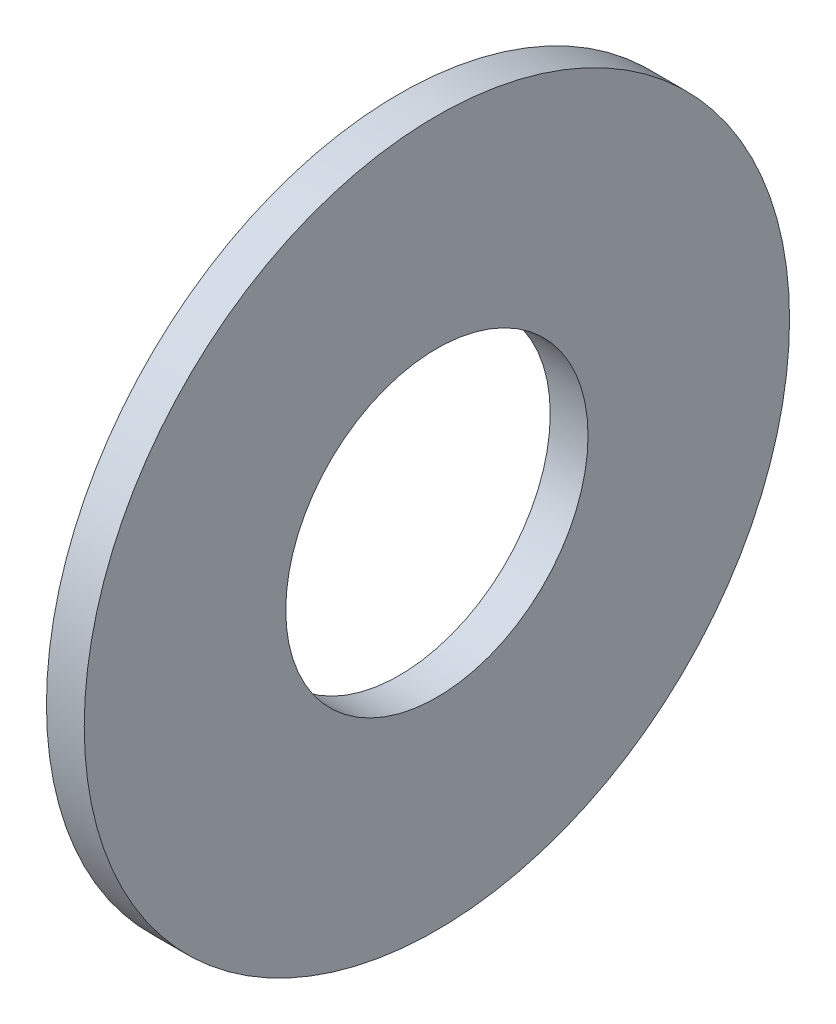
ISO-10303-21;
HEADER;
FILE_DESCRIPTION(('STEP AP214'),'2;1');
FILE_NAME('part.step','',(''),(''),'','','');
FILE_SCHEMA(('AUTOMOTIVE_DESIGN { 1 0 10303 214 1 1 1 1 }'));
ENDSEC;
DATA;
#1=APPLICATION_CONTEXT('core data for automotive mechanical design processes');
#2=APPLICATION_PROTOCOL_DEFINITION('international standard','automotive_design',2000,#1);
#3=PRODUCT_CONTEXT('',#1,'mechanical');
#4=PRODUCT('Part','Part','',(#3));
#5=PRODUCT_RELATED_PRODUCT_CATEGORY('part','',(#4));
#6=PRODUCT_DEFINITION_FORMATION('','',#4);
#7=PRODUCT_DEFINITION_CONTEXT('part definition',#1,'design');
#8=PRODUCT_DEFINITION('design','',#6,#7);
#9=PRODUCT_DEFINITION_SHAPE('','',#8);
#10=(LENGTH_UNIT() NAMED_UNIT(*) SI_UNIT(.MILLI.,.METRE.));
#11=(NAMED_UNIT(*) PLANE_ANGLE_UNIT() SI_UNIT($,.RADIAN.));
#12=(NAMED_UNIT(*) SI_UNIT($,.STERADIAN.) SOLID_ANGLE_UNIT());
#13=UNCERTAINTY_MEASURE_WITH_UNIT(LENGTH_MEASURE(1.E-05),#10,'distance_accuracy_value','');
#14=(GEOMETRIC_REPRESENTATION_CONTEXT(3) GLOBAL_UNCERTAINTY_ASSIGNED_CONTEXT((#13)) GLOBAL_UNIT_ASSIGNED_CONTEXT((#10,
#11,#12)) REPRESENTATION_CONTEXT('',''));
#15=CARTESIAN_POINT('',(0.,0.,0.));
#16=DIRECTION('',(0.,0.,1.));
#17=DIRECTION('',(1.,0.,0.));
#18=AXIS2_PLACEMENT_3D('',#15,#16,#17);
#19=CARTESIAN_POINT('',(0.75,0.,0.));
#20=DIRECTION('',(1.,0.,0.));
#21=DIRECTION('',(0.,0.,-1.));
#22=AXIS2_PLACEMENT_3D('',#19,#20,#21);
#23=PLANE('',#22);
#24=CARTESIAN_POINT('',(0.75,0.,0.));
#25=DIRECTION('',(1.,0.,0.));
#26=DIRECTION('',(0.,0.,-1.));
#27=AXIS2_PLACEMENT_3D('',#24,#25,#26);
#28=CIRCLE('',#27,7.);
#29=CARTESIAN_POINT('',(0.75,0.,-7.));
#30=VERTEX_POINT('',#29);
#31=EDGE_CURVE('E10',#30,#30,#28,.T.);
#32=ORIENTED_EDGE('',*,*,#31,.T.);
#33=EDGE_LOOP('',(#32));
#34=FACE_BOUND('',#33,.T.);
#35=CARTESIAN_POINT('',(0.75,0.,0.));
#36=DIRECTION('',(1.,0.,0.));
#37=DIRECTION('',(0.,0.,-1.));
#38=AXIS2_PLACEMENT_3D('',#35,#36,#37);
#39=CIRCLE('',#38,3.);
#40=CARTESIAN_POINT('',(0.75,0.,-3.));
#41=VERTEX_POINT('',#40);
#42=EDGE_CURVE('E50',#41,#41,#39,.T.);
#43=ORIENTED_EDGE('',*,*,#42,.F.);
#44=EDGE_LOOP('',(#43));
#45=FACE_BOUND('',#44,.T.);
#46=ADVANCED_FACE('F37',(#34,#45),#23,.T.);
#47=CARTESIAN_POINT('',(0.,0.,0.));
#48=DIRECTION('',(1.,0.,0.));
#49=DIRECTION('',(0.,0.,-1.));
#50=AXIS2_PLACEMENT_3D('',#47,#48,#49);
#51=PLANE('',#50);
#52=CARTESIAN_POINT('',(0.,0.,0.));
#53=DIRECTION('',(1.,0.,0.));
#54=DIRECTION('',(0.,0.,-1.));
#55=AXIS2_PLACEMENT_3D('',#52,#53,#54);
#56=CIRCLE('',#55,7.);
#57=CARTESIAN_POINT('',(0.,0.,-7.));
#58=VERTEX_POINT('',#57);
#59=EDGE_CURVE('E41',#58,#58,#56,.T.);
#60=ORIENTED_EDGE('',*,*,#59,.F.);
#61=EDGE_LOOP('',(#60));
#62=FACE_BOUND('',#61,.T.);
#63=CARTESIAN_POINT('',(0.,0.,0.));
#64=DIRECTION('',(1.,0.,0.));
#65=DIRECTION('',(0.,0.,-1.));
#66=AXIS2_PLACEMENT_3D('',#63,#64,#65);
#67=CIRCLE('',#66,3.);
#68=CARTESIAN_POINT('',(0.,0.,-3.));
#69=VERTEX_POINT('',#68);
#70=EDGE_CURVE('E52',#69,#69,#67,.T.);
#71=ORIENTED_EDGE('',*,*,#70,.T.);
#72=EDGE_LOOP('',(#71));
#73=FACE_BOUND('',#72,.T.);
#74=ADVANCED_FACE('F64',(#62,#73),#51,.F.);
#75=CARTESIAN_POINT('',(0.75,0.,0.));
#76=DIRECTION('',(-1.,0.,0.));
#77=DIRECTION('',(0.,0.,1.));
#78=AXIS2_PLACEMENT_3D('',#75,#76,#77);
#79=CYLINDRICAL_SURFACE('',#78,7.);
#80=ORIENTED_EDGE('',*,*,#31,.F.);
#81=EDGE_LOOP('',(#80));
#82=FACE_BOUND('',#81,.T.);
#83=ORIENTED_EDGE('',*,*,#59,.T.);
#84=EDGE_LOOP('',(#83));
#85=FACE_BOUND('',#84,.T.);
#86=ADVANCED_FACE('F39',(#82,#85),#79,.T.);
#87=CARTESIAN_POINT('',(0.75,0.,0.));
#88=DIRECTION('',(-1.,0.,0.));
#89=DIRECTION('',(0.,0.,1.));
#90=AXIS2_PLACEMENT_3D('',#87,#88,#89);
#91=CYLINDRICAL_SURFACE('',#90,3.);
#92=ORIENTED_EDGE('',*,*,#42,.T.);
#93=EDGE_LOOP('',(#92));
#94=FACE_BOUND('',#93,.T.);
#95=ORIENTED_EDGE('',*,*,#70,.F.);
#96=EDGE_LOOP('',(#95));
#97=FACE_BOUND('',#96,.T.);
#98=ADVANCED_FACE('F60',(#94,#97),#91,.F.);
#99=CLOSED_SHELL('',(#46,#74,#86,#98));
#100=MANIFOLD_SOLID_BREP('B2',#99);
#101=ADVANCED_BREP_SHAPE_REPRESENTATION('',(#18,#100),#14);
#102=SHAPE_DEFINITION_REPRESENTATION(#9,#101);
ENDSEC;
END-ISO-10303-21;
